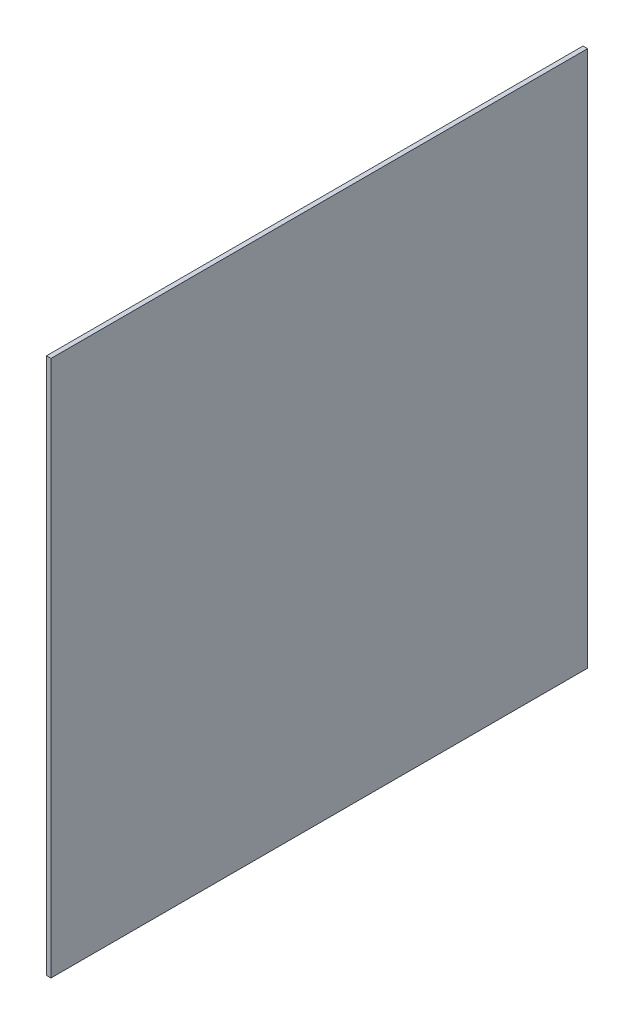
ISO-10303-21;
HEADER;
FILE_DESCRIPTION(('STEP AP214'),'2;1');
FILE_NAME('part.step','',(''),(''),'','','');
FILE_SCHEMA(('AUTOMOTIVE_DESIGN { 1 0 10303 214 1 1 1 1 }'));
ENDSEC;
DATA;
#1=APPLICATION_CONTEXT('core data for automotive mechanical design processes');
#2=APPLICATION_PROTOCOL_DEFINITION('international standard','automotive_design',2000,#1);
#3=PRODUCT_CONTEXT('',#1,'mechanical');
#4=PRODUCT('Part','Part','',(#3));
#5=PRODUCT_RELATED_PRODUCT_CATEGORY('part','',(#4));
#6=PRODUCT_DEFINITION_FORMATION('','',#4);
#7=PRODUCT_DEFINITION_CONTEXT('part definition',#1,'design');
#8=PRODUCT_DEFINITION('design','',#6,#7);
#9=PRODUCT_DEFINITION_SHAPE('','',#8);
#10=(LENGTH_UNIT() NAMED_UNIT(*) SI_UNIT(.MILLI.,.METRE.));
#11=(NAMED_UNIT(*) PLANE_ANGLE_UNIT() SI_UNIT($,.RADIAN.));
#12=(NAMED_UNIT(*) SI_UNIT($,.STERADIAN.) SOLID_ANGLE_UNIT());
#13=UNCERTAINTY_MEASURE_WITH_UNIT(LENGTH_MEASURE(1.E-05),#10,'distance_accuracy_value','');
#14=(GEOMETRIC_REPRESENTATION_CONTEXT(3) GLOBAL_UNCERTAINTY_ASSIGNED_CONTEXT((#13)) GLOBAL_UNIT_ASSIGNED_CONTEXT((#10,
#11,#12)) REPRESENTATION_CONTEXT('',''));
#15=CARTESIAN_POINT('',(0.,0.,0.));
#16=DIRECTION('',(0.,0.,1.));
#17=DIRECTION('',(1.,0.,0.));
#18=AXIS2_PLACEMENT_3D('',#15,#16,#17);
#19=CARTESIAN_POINT('',(2.,-117.3,117.3));
#20=DIRECTION('',(0.,0.,-1.));
#21=DIRECTION('',(-1.,0.,0.));
#22=AXIS2_PLACEMENT_3D('',#19,#20,#21);
#23=PLANE('',#22);
#24=DIRECTION('',(0.,-1.,0.));
#25=VECTOR('',#24,1.);
#26=CARTESIAN_POINT('',(0.,-117.3,117.3));
#27=LINE('',#26,#25);
#28=CARTESIAN_POINT('',(0.,117.3,117.3));
#29=VERTEX_POINT('',#28);
#30=CARTESIAN_POINT('',(0.,-117.3,117.3));
#31=VERTEX_POINT('',#30);
#32=EDGE_CURVE('E96',#29,#31,#27,.T.);
#33=ORIENTED_EDGE('',*,*,#32,.T.);
#34=DIRECTION('',(-1.,0.,0.));
#35=VECTOR('',#34,1.);
#36=CARTESIAN_POINT('',(2.,-117.3,117.3));
#37=LINE('',#36,#35);
#38=CARTESIAN_POINT('',(2.,-117.3,117.3));
#39=VERTEX_POINT('',#38);
#40=EDGE_CURVE('E11',#39,#31,#37,.T.);
#41=ORIENTED_EDGE('',*,*,#40,.F.);
#42=DIRECTION('',(0.,-1.,0.));
#43=VECTOR('',#42,1.);
#44=CARTESIAN_POINT('',(2.,-117.3,117.3));
#45=LINE('',#44,#43);
#46=CARTESIAN_POINT('',(2.,117.3,117.3));
#47=VERTEX_POINT('',#46);
#48=EDGE_CURVE('E84',#47,#39,#45,.T.);
#49=ORIENTED_EDGE('',*,*,#48,.F.);
#50=DIRECTION('',(-1.,0.,0.));
#51=VECTOR('',#50,1.);
#52=CARTESIAN_POINT('',(2.,117.3,117.3));
#53=LINE('',#52,#51);
#54=EDGE_CURVE('E92',#47,#29,#53,.T.);
#55=ORIENTED_EDGE('',*,*,#54,.T.);
#56=EDGE_LOOP('',(#33,#41,#49,#55));
#57=FACE_BOUND('',#56,.T.);
#58=ADVANCED_FACE('F33',(#57),#23,.F.);
#59=CARTESIAN_POINT('',(2.,-117.3,-117.3));
#60=DIRECTION('',(0.,1.,0.));
#61=DIRECTION('',(0.,0.,1.));
#62=AXIS2_PLACEMENT_3D('',#59,#60,#61);
#63=PLANE('',#62);
#64=DIRECTION('',(0.,0.,-1.));
#65=VECTOR('',#64,1.);
#66=CARTESIAN_POINT('',(0.,-117.3,-117.3));
#67=LINE('',#66,#65);
#68=CARTESIAN_POINT('',(0.,-117.3,-117.3));
#69=VERTEX_POINT('',#68);
#70=EDGE_CURVE('E88',#31,#69,#67,.T.);
#71=ORIENTED_EDGE('',*,*,#70,.T.);
#72=DIRECTION('',(-1.,0.,0.));
#73=VECTOR('',#72,1.);
#74=CARTESIAN_POINT('',(2.,-117.3,-117.3));
#75=LINE('',#74,#73);
#76=CARTESIAN_POINT('',(2.,-117.3,-117.3));
#77=VERTEX_POINT('',#76);
#78=EDGE_CURVE('E41',#77,#69,#75,.T.);
#79=ORIENTED_EDGE('',*,*,#78,.F.);
#80=DIRECTION('',(0.,0.,-1.));
#81=VECTOR('',#80,1.);
#82=CARTESIAN_POINT('',(2.,-117.3,-117.3));
#83=LINE('',#82,#81);
#84=EDGE_CURVE('E79',#39,#77,#83,.T.);
#85=ORIENTED_EDGE('',*,*,#84,.F.);
#86=ORIENTED_EDGE('',*,*,#40,.T.);
#87=EDGE_LOOP('',(#71,#79,#85,#86));
#88=FACE_BOUND('',#87,.T.);
#89=ADVANCED_FACE('F87',(#88),#63,.F.);
#90=CARTESIAN_POINT('',(2.,-117.3,-117.3));
#91=DIRECTION('',(0.,0.,1.));
#92=DIRECTION('',(1.,0.,0.));
#93=AXIS2_PLACEMENT_3D('',#90,#91,#92);
#94=PLANE('',#93);
#95=DIRECTION('',(0.,1.,0.));
#96=VECTOR('',#95,1.);
#97=CARTESIAN_POINT('',(0.,-117.3,-117.3));
#98=LINE('',#97,#96);
#99=CARTESIAN_POINT('',(0.,117.3,-117.3));
#100=VERTEX_POINT('',#99);
#101=EDGE_CURVE('E66',#69,#100,#98,.T.);
#102=ORIENTED_EDGE('',*,*,#101,.T.);
#103=DIRECTION('',(-1.,0.,0.));
#104=VECTOR('',#103,1.);
#105=CARTESIAN_POINT('',(2.,117.3,-117.3));
#106=LINE('',#105,#104);
#107=CARTESIAN_POINT('',(2.,117.3,-117.3));
#108=VERTEX_POINT('',#107);
#109=EDGE_CURVE('E89',#108,#100,#106,.T.);
#110=ORIENTED_EDGE('',*,*,#109,.F.);
#111=DIRECTION('',(0.,1.,0.));
#112=VECTOR('',#111,1.);
#113=CARTESIAN_POINT('',(2.,-117.3,-117.3));
#114=LINE('',#113,#112);
#115=EDGE_CURVE('E82',#77,#108,#114,.T.);
#116=ORIENTED_EDGE('',*,*,#115,.F.);
#117=ORIENTED_EDGE('',*,*,#78,.T.);
#118=EDGE_LOOP('',(#102,#110,#116,#117));
#119=FACE_BOUND('',#118,.T.);
#120=ADVANCED_FACE('F90',(#119),#94,.F.);
#121=CARTESIAN_POINT('',(2.,117.3,-117.3));
#122=DIRECTION('',(0.,-1.,0.));
#123=DIRECTION('',(0.,0.,-1.));
#124=AXIS2_PLACEMENT_3D('',#121,#122,#123);
#125=PLANE('',#124);
#126=DIRECTION('',(0.,0.,1.));
#127=VECTOR('',#126,1.);
#128=CARTESIAN_POINT('',(0.,117.3,-117.3));
#129=LINE('',#128,#127);
#130=EDGE_CURVE('E72',#100,#29,#129,.T.);
#131=ORIENTED_EDGE('',*,*,#130,.T.);
#132=ORIENTED_EDGE('',*,*,#54,.F.);
#133=DIRECTION('',(0.,0.,1.));
#134=VECTOR('',#133,1.);
#135=CARTESIAN_POINT('',(2.,117.3,-117.3));
#136=LINE('',#135,#134);
#137=EDGE_CURVE('E49',#108,#47,#136,.T.);
#138=ORIENTED_EDGE('',*,*,#137,.F.);
#139=ORIENTED_EDGE('',*,*,#109,.T.);
#140=EDGE_LOOP('',(#131,#132,#138,#139));
#141=FACE_BOUND('',#140,.T.);
#142=ADVANCED_FACE('F103',(#141),#125,.F.);
#143=CARTESIAN_POINT('',(2.,0.,0.));
#144=DIRECTION('',(1.,0.,0.));
#145=DIRECTION('',(0.,0.,-1.));
#146=AXIS2_PLACEMENT_3D('',#143,#144,#145);
#147=PLANE('',#146);
#148=ORIENTED_EDGE('',*,*,#48,.T.);
#149=ORIENTED_EDGE('',*,*,#84,.T.);
#150=ORIENTED_EDGE('',*,*,#115,.T.);
#151=ORIENTED_EDGE('',*,*,#137,.T.);
#152=EDGE_LOOP('',(#148,#149,#150,#151));
#153=FACE_BOUND('',#152,.T.);
#154=ADVANCED_FACE('F80',(#153),#147,.T.);
#155=CARTESIAN_POINT('',(0.,0.,0.));
#156=DIRECTION('',(1.,0.,0.));
#157=DIRECTION('',(0.,0.,-1.));
#158=AXIS2_PLACEMENT_3D('',#155,#156,#157);
#159=PLANE('',#158);
#160=ORIENTED_EDGE('',*,*,#32,.F.);
#161=ORIENTED_EDGE('',*,*,#130,.F.);
#162=ORIENTED_EDGE('',*,*,#101,.F.);
#163=ORIENTED_EDGE('',*,*,#70,.F.);
#164=EDGE_LOOP('',(#160,#161,#162,#163));
#165=FACE_BOUND('',#164,.T.);
#166=ADVANCED_FACE('F106',(#165),#159,.F.);
#167=CLOSED_SHELL('',(#58,#89,#120,#142,#154,#166));
#168=MANIFOLD_SOLID_BREP('B2',#167);
#169=ADVANCED_BREP_SHAPE_REPRESENTATION('',(#18,#168),#14);
#170=SHAPE_DEFINITION_REPRESENTATION(#9,#169);
ENDSEC;
END-ISO-10303-21;
